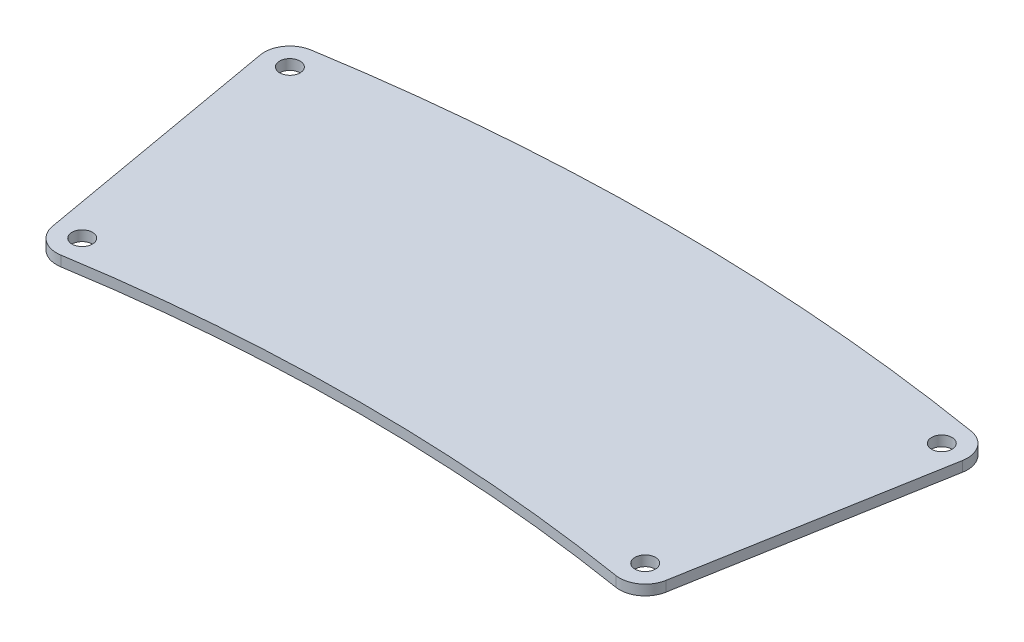
ISO-10303-21;
HEADER;
FILE_DESCRIPTION(('STEP AP214'),'2;1');
FILE_NAME('part.step','',(''),(''),'','','');
FILE_SCHEMA(('AUTOMOTIVE_DESIGN { 1 0 10303 214 1 1 1 1 }'));
ENDSEC;
DATA;
#1=APPLICATION_CONTEXT('core data for automotive mechanical design processes');
#2=APPLICATION_PROTOCOL_DEFINITION('international standard','automotive_design',2000,#1);
#3=PRODUCT_CONTEXT('',#1,'mechanical');
#4=PRODUCT('Part','Part','',(#3));
#5=PRODUCT_RELATED_PRODUCT_CATEGORY('part','',(#4));
#6=PRODUCT_DEFINITION_FORMATION('','',#4);
#7=PRODUCT_DEFINITION_CONTEXT('part definition',#1,'design');
#8=PRODUCT_DEFINITION('design','',#6,#7);
#9=PRODUCT_DEFINITION_SHAPE('','',#8);
#10=(LENGTH_UNIT() NAMED_UNIT(*) SI_UNIT(.MILLI.,.METRE.));
#11=(NAMED_UNIT(*) PLANE_ANGLE_UNIT() SI_UNIT($,.RADIAN.));
#12=(NAMED_UNIT(*) SI_UNIT($,.STERADIAN.) SOLID_ANGLE_UNIT());
#13=UNCERTAINTY_MEASURE_WITH_UNIT(LENGTH_MEASURE(1.E-05),#10,'distance_accuracy_value','');
#14=(GEOMETRIC_REPRESENTATION_CONTEXT(3) GLOBAL_UNCERTAINTY_ASSIGNED_CONTEXT((#13)) GLOBAL_UNIT_ASSIGNED_CONTEXT((#10,
#11,#12)) REPRESENTATION_CONTEXT('',''));
#15=CARTESIAN_POINT('',(0.,0.,0.));
#16=DIRECTION('',(0.,0.,1.));
#17=DIRECTION('',(1.,0.,0.));
#18=AXIS2_PLACEMENT_3D('',#15,#16,#17);
#19=CARTESIAN_POINT('',(0.,-2.,0.));
#20=DIRECTION('',(0.,1.,0.));
#21=DIRECTION('',(0.,0.,1.));
#22=AXIS2_PLACEMENT_3D('',#19,#20,#21);
#23=CYLINDRICAL_SURFACE('',#22,340.);
#24=CARTESIAN_POINT('',(0.,0.,0.));
#25=DIRECTION('',(0.,-1.,0.));
#26=DIRECTION('',(0.,0.,1.));
#27=AXIS2_PLACEMENT_3D('',#24,#25,#26);
#28=CIRCLE('',#27,340.);
#29=CARTESIAN_POINT('',(-54.1815037787085,0.,-335.655127546531));
#30=VERTEX_POINT('',#29);
#31=CARTESIAN_POINT('',(54.1815037787058,0.,-335.655127546531));
#32=VERTEX_POINT('',#31);
#33=EDGE_CURVE('E163',#30,#32,#28,.T.);
#34=ORIENTED_EDGE('',*,*,#33,.F.);
#35=DIRECTION('',(0.,1.,0.));
#36=VECTOR('',#35,1.);
#37=CARTESIAN_POINT('',(-54.1815037787085,-2.,-335.655127546531));
#38=LINE('',#37,#36);
#39=CARTESIAN_POINT('',(-54.1815037787085,-2.,-335.655127546531));
#40=VERTEX_POINT('',#39);
#41=EDGE_CURVE('E143',#30,#40,#38,.F.);
#42=ORIENTED_EDGE('',*,*,#41,.T.);
#43=CARTESIAN_POINT('',(0.,-2.,0.));
#44=DIRECTION('',(0.,-1.,0.));
#45=DIRECTION('',(0.,0.,1.));
#46=AXIS2_PLACEMENT_3D('',#43,#44,#45);
#47=CIRCLE('',#46,340.);
#48=CARTESIAN_POINT('',(54.1815037787058,-2.,-335.655127546531));
#49=VERTEX_POINT('',#48);
#50=EDGE_CURVE('E124',#40,#49,#47,.T.);
#51=ORIENTED_EDGE('',*,*,#50,.T.);
#52=DIRECTION('',(0.,1.,0.));
#53=VECTOR('',#52,1.);
#54=CARTESIAN_POINT('',(54.1815037787058,-2.,-335.655127546531));
#55=LINE('',#54,#53);
#56=EDGE_CURVE('E140',#49,#32,#55,.T.);
#57=ORIENTED_EDGE('',*,*,#56,.T.);
#58=EDGE_LOOP('',(#34,#42,#51,#57));
#59=FACE_BOUND('',#58,.T.);
#60=ADVANCED_FACE('F37',(#59),#23,.F.);
#61=CARTESIAN_POINT('',(-59.0403804067566,-2.,-334.834636024151));
#62=DIRECTION('',(-0.984807753012208,0.,0.173648177666931));
#63=DIRECTION('',(0.173648177666931,0.,0.984807753012208));
#64=AXIS2_PLACEMENT_3D('',#61,#62,#63);
#65=PLANE('',#64);
#66=DIRECTION('',(0.173648177666931,0.,0.984807753012208));
#67=VECTOR('',#66,1.);
#68=CARTESIAN_POINT('',(-59.0403804067566,-2.,-334.834636024151));
#69=LINE('',#68,#67);
#70=CARTESIAN_POINT('',(-68.5855347627996,-2.,-388.967896389022));
#71=VERTEX_POINT('',#70);
#72=CARTESIAN_POINT('',(-59.9023293640447,-2.,-339.722991475057));
#73=VERTEX_POINT('',#72);
#74=EDGE_CURVE('E129',#71,#73,#69,.T.);
#75=ORIENTED_EDGE('',*,*,#74,.T.);
#76=DIRECTION('',(0.,1.,0.));
#77=VECTOR('',#76,1.);
#78=CARTESIAN_POINT('',(-59.9023293640447,-2.,-339.722991475057));
#79=LINE('',#78,#77);
#80=CARTESIAN_POINT('',(-59.9023293640447,0.,-339.722991475057));
#81=VERTEX_POINT('',#80);
#82=EDGE_CURVE('E123',#73,#81,#79,.T.);
#83=ORIENTED_EDGE('',*,*,#82,.T.);
#84=DIRECTION('',(0.173648177666931,0.,0.984807753012208));
#85=VECTOR('',#84,1.);
#86=CARTESIAN_POINT('',(-59.0403804067566,0.,-334.834636024151));
#87=LINE('',#86,#85);
#88=CARTESIAN_POINT('',(-68.5855347627996,0.,-388.967896389022));
#89=VERTEX_POINT('',#88);
#90=EDGE_CURVE('E106',#89,#81,#87,.T.);
#91=ORIENTED_EDGE('',*,*,#90,.F.);
#92=DIRECTION('',(0.,1.,0.));
#93=VECTOR('',#92,1.);
#94=CARTESIAN_POINT('',(-68.5855347627996,-2.,-388.967896389022));
#95=LINE('',#94,#93);
#96=EDGE_CURVE('E120',#89,#71,#95,.F.);
#97=ORIENTED_EDGE('',*,*,#96,.T.);
#98=EDGE_LOOP('',(#75,#83,#91,#97));
#99=FACE_BOUND('',#98,.T.);
#100=ADVANCED_FACE('F119',(#99),#65,.T.);
#101=CARTESIAN_POINT('',(0.,-2.,0.));
#102=DIRECTION('',(0.,1.,0.));
#103=DIRECTION('',(0.,0.,1.));
#104=AXIS2_PLACEMENT_3D('',#101,#102,#103);
#105=CYLINDRICAL_SURFACE('',#104,400.);
#106=CARTESIAN_POINT('',(0.,-2.,0.));
#107=DIRECTION('',(0.,1.,0.));
#108=DIRECTION('',(0.,0.,1.));
#109=AXIS2_PLACEMENT_3D('',#106,#107,#108);
#110=CIRCLE('',#109,400.);
#111=CARTESIAN_POINT('',(64.4673377192258,-2.,-394.770771926437));
#112=VERTEX_POINT('',#111);
#113=CARTESIAN_POINT('',(-64.467337719229,-2.,-394.770771926437));
#114=VERTEX_POINT('',#113);
#115=EDGE_CURVE('E133',#112,#114,#110,.T.);
#116=ORIENTED_EDGE('',*,*,#115,.T.);
#117=DIRECTION('',(0.,1.,0.));
#118=VECTOR('',#117,1.);
#119=CARTESIAN_POINT('',(-64.467337719229,-2.,-394.770771926437));
#120=LINE('',#119,#118);
#121=CARTESIAN_POINT('',(-64.467337719229,0.,-394.770771926437));
#122=VERTEX_POINT('',#121);
#123=EDGE_CURVE('E153',#114,#122,#120,.T.);
#124=ORIENTED_EDGE('',*,*,#123,.T.);
#125=CARTESIAN_POINT('',(0.,0.,0.));
#126=DIRECTION('',(0.,1.,0.));
#127=DIRECTION('',(0.,0.,1.));
#128=AXIS2_PLACEMENT_3D('',#125,#126,#127);
#129=CIRCLE('',#128,400.);
#130=CARTESIAN_POINT('',(64.4673377192258,0.,-394.770771926437));
#131=VERTEX_POINT('',#130);
#132=EDGE_CURVE('E108',#131,#122,#129,.T.);
#133=ORIENTED_EDGE('',*,*,#132,.F.);
#134=DIRECTION('',(0.,1.,0.));
#135=VECTOR('',#134,1.);
#136=CARTESIAN_POINT('',(64.4673377192258,-2.,-394.770771926438));
#137=LINE('',#136,#135);
#138=EDGE_CURVE('E151',#131,#112,#137,.F.);
#139=ORIENTED_EDGE('',*,*,#138,.T.);
#140=EDGE_LOOP('',(#116,#124,#133,#139));
#141=FACE_BOUND('',#140,.T.);
#142=ADVANCED_FACE('F156',(#141),#105,.T.);
#143=CARTESIAN_POINT('',(69.4592710667694,-2.,-393.923101204884));
#144=DIRECTION('',(0.984807753012209,0.,0.173648177666924));
#145=DIRECTION('',(0.173648177666924,0.,-0.984807753012209));
#146=AXIS2_PLACEMENT_3D('',#143,#144,#145);
#147=PLANE('',#146);
#148=DIRECTION('',(0.173648177666924,0.,-0.984807753012209));
#149=VECTOR('',#148,1.);
#150=CARTESIAN_POINT('',(69.4592710667694,-2.,-393.923101204884));
#151=LINE('',#150,#149);
#152=CARTESIAN_POINT('',(59.902329364042,-2.,-339.722991475057));
#153=VERTEX_POINT('',#152);
#154=CARTESIAN_POINT('',(68.5855347627966,-2.,-388.967896389023));
#155=VERTEX_POINT('',#154);
#156=EDGE_CURVE('E158',#153,#155,#151,.T.);
#157=ORIENTED_EDGE('',*,*,#156,.T.);
#158=DIRECTION('',(0.,1.,0.));
#159=VECTOR('',#158,1.);
#160=CARTESIAN_POINT('',(68.5855347627966,-2.,-388.967896389023));
#161=LINE('',#160,#159);
#162=CARTESIAN_POINT('',(68.5855347627966,0.,-388.967896389023));
#163=VERTEX_POINT('',#162);
#164=EDGE_CURVE('E11',#155,#163,#161,.T.);
#165=ORIENTED_EDGE('',*,*,#164,.T.);
#166=DIRECTION('',(0.173648177666924,0.,-0.984807753012209));
#167=VECTOR('',#166,1.);
#168=CARTESIAN_POINT('',(69.4592710667694,0.,-393.923101204884));
#169=LINE('',#168,#167);
#170=CARTESIAN_POINT('',(59.902329364042,0.,-339.722991475057));
#171=VERTEX_POINT('',#170);
#172=EDGE_CURVE('E166',#171,#163,#169,.T.);
#173=ORIENTED_EDGE('',*,*,#172,.F.);
#174=DIRECTION('',(0.,1.,0.));
#175=VECTOR('',#174,1.);
#176=CARTESIAN_POINT('',(59.902329364042,-2.,-339.722991475057));
#177=LINE('',#176,#175);
#178=EDGE_CURVE('E45',#171,#153,#177,.F.);
#179=ORIENTED_EDGE('',*,*,#178,.T.);
#180=EDGE_LOOP('',(#157,#165,#173,#179));
#181=FACE_BOUND('',#180,.T.);
#182=ADVANCED_FACE('F169',(#181),#147,.T.);
#183=CARTESIAN_POINT('',(0.,-2.,0.));
#184=DIRECTION('',(0.,1.,0.));
#185=DIRECTION('',(0.,0.,1.));
#186=AXIS2_PLACEMENT_3D('',#183,#184,#185);
#187=PLANE('',#186);
#188=CARTESIAN_POINT('',(54.9782905989809,-2.,-340.591232363392));
#189=DIRECTION('',(0.,1.,0.));
#190=DIRECTION('',(0.,0.,1.));
#191=AXIS2_PLACEMENT_3D('',#188,#189,#190);
#192=CIRCLE('',#191,2.);
#193=CARTESIAN_POINT('',(54.9782905989809,-2.,-338.591232363392));
#194=VERTEX_POINT('',#193);
#195=EDGE_CURVE('E199',#194,#194,#192,.T.);
#196=ORIENTED_EDGE('',*,*,#195,.T.);
#197=EDGE_LOOP('',(#196));
#198=FACE_BOUND('',#197,.T.);
#199=CARTESIAN_POINT('',(63.6614959977355,-2.,-389.836137277357));
#200=DIRECTION('',(0.,1.,0.));
#201=DIRECTION('',(0.,0.,1.));
#202=AXIS2_PLACEMENT_3D('',#199,#200,#201);
#203=CIRCLE('',#202,2.);
#204=CARTESIAN_POINT('',(63.6614959977355,-2.,-387.836137277357));
#205=VERTEX_POINT('',#204);
#206=EDGE_CURVE('E193',#205,#205,#203,.T.);
#207=ORIENTED_EDGE('',*,*,#206,.T.);
#208=EDGE_LOOP('',(#207));
#209=FACE_BOUND('',#208,.T.);
#210=CARTESIAN_POINT('',(-54.9782905989836,-2.,-340.591232363391));
#211=DIRECTION('',(0.,1.,0.));
#212=DIRECTION('',(0.,0.,1.));
#213=AXIS2_PLACEMENT_3D('',#210,#211,#212);
#214=CIRCLE('',#213,2.);
#215=CARTESIAN_POINT('',(-54.9782905989836,-2.,-338.591232363391));
#216=VERTEX_POINT('',#215);
#217=EDGE_CURVE('E187',#216,#216,#214,.T.);
#218=ORIENTED_EDGE('',*,*,#217,.T.);
#219=EDGE_LOOP('',(#218));
#220=FACE_BOUND('',#219,.T.);
#221=CARTESIAN_POINT('',(-63.6614959977386,-2.,-389.836137277356));
#222=DIRECTION('',(0.,1.,0.));
#223=DIRECTION('',(0.,0.,1.));
#224=AXIS2_PLACEMENT_3D('',#221,#222,#223);
#225=CIRCLE('',#224,2.);
#226=CARTESIAN_POINT('',(-63.6614959977386,-2.,-387.836137277356));
#227=VERTEX_POINT('',#226);
#228=EDGE_CURVE('E167',#227,#227,#225,.T.);
#229=ORIENTED_EDGE('',*,*,#228,.T.);
#230=EDGE_LOOP('',(#229));
#231=FACE_BOUND('',#230,.T.);
#232=ORIENTED_EDGE('',*,*,#50,.F.);
#233=CARTESIAN_POINT('',(-54.9782905989836,-2.,-340.591232363391));
#234=DIRECTION('',(0.,1.,0.));
#235=DIRECTION('',(0.,0.,1.));
#236=AXIS2_PLACEMENT_3D('',#233,#234,#235);
#237=CIRCLE('',#236,5.);
#238=EDGE_CURVE('E149',#40,#73,#237,.F.);
#239=ORIENTED_EDGE('',*,*,#238,.T.);
#240=ORIENTED_EDGE('',*,*,#74,.F.);
#241=CARTESIAN_POINT('',(-63.6614959977386,-2.,-389.836137277356));
#242=DIRECTION('',(0.,1.,0.));
#243=DIRECTION('',(0.,0.,1.));
#244=AXIS2_PLACEMENT_3D('',#241,#242,#243);
#245=CIRCLE('',#244,5.);
#246=EDGE_CURVE('E128',#71,#114,#245,.F.);
#247=ORIENTED_EDGE('',*,*,#246,.T.);
#248=ORIENTED_EDGE('',*,*,#115,.F.);
#249=CARTESIAN_POINT('',(63.6614959977355,-2.,-389.836137277357));
#250=DIRECTION('',(0.,1.,0.));
#251=DIRECTION('',(0.,0.,1.));
#252=AXIS2_PLACEMENT_3D('',#249,#250,#251);
#253=CIRCLE('',#252,5.);
#254=EDGE_CURVE('E52',#112,#155,#253,.F.);
#255=ORIENTED_EDGE('',*,*,#254,.T.);
#256=ORIENTED_EDGE('',*,*,#156,.F.);
#257=CARTESIAN_POINT('',(54.9782905989809,-2.,-340.591232363392));
#258=DIRECTION('',(0.,1.,0.));
#259=DIRECTION('',(0.,0.,1.));
#260=AXIS2_PLACEMENT_3D('',#257,#258,#259);
#261=CIRCLE('',#260,5.);
#262=EDGE_CURVE('E145',#153,#49,#261,.F.);
#263=ORIENTED_EDGE('',*,*,#262,.T.);
#264=EDGE_LOOP('',(#232,#239,#240,#247,#248,#255,#256,#263));
#265=FACE_BOUND('',#264,.T.);
#266=ADVANCED_FACE('F176',(#198,#209,#220,#231,#265),#187,.F.);
#267=CARTESIAN_POINT('',(0.,0.,0.));
#268=DIRECTION('',(0.,1.,0.));
#269=DIRECTION('',(0.,0.,1.));
#270=AXIS2_PLACEMENT_3D('',#267,#268,#269);
#271=PLANE('',#270);
#272=CARTESIAN_POINT('',(54.9782905989809,0.,-340.591232363392));
#273=DIRECTION('',(0.,1.,0.));
#274=DIRECTION('',(0.,0.,1.));
#275=AXIS2_PLACEMENT_3D('',#272,#273,#274);
#276=CIRCLE('',#275,2.);
#277=CARTESIAN_POINT('',(54.9782905989809,0.,-338.591232363392));
#278=VERTEX_POINT('',#277);
#279=EDGE_CURVE('E202',#278,#278,#276,.T.);
#280=ORIENTED_EDGE('',*,*,#279,.F.);
#281=EDGE_LOOP('',(#280));
#282=FACE_BOUND('',#281,.T.);
#283=CARTESIAN_POINT('',(63.6614959977355,0.,-389.836137277357));
#284=DIRECTION('',(0.,1.,0.));
#285=DIRECTION('',(0.,0.,1.));
#286=AXIS2_PLACEMENT_3D('',#283,#284,#285);
#287=CIRCLE('',#286,2.);
#288=CARTESIAN_POINT('',(63.6614959977355,0.,-387.836137277357));
#289=VERTEX_POINT('',#288);
#290=EDGE_CURVE('E196',#289,#289,#287,.T.);
#291=ORIENTED_EDGE('',*,*,#290,.F.);
#292=EDGE_LOOP('',(#291));
#293=FACE_BOUND('',#292,.T.);
#294=CARTESIAN_POINT('',(-54.9782905989836,0.,-340.591232363391));
#295=DIRECTION('',(0.,1.,0.));
#296=DIRECTION('',(0.,0.,1.));
#297=AXIS2_PLACEMENT_3D('',#294,#295,#296);
#298=CIRCLE('',#297,2.);
#299=CARTESIAN_POINT('',(-54.9782905989836,0.,-338.591232363391));
#300=VERTEX_POINT('',#299);
#301=EDGE_CURVE('E190',#300,#300,#298,.T.);
#302=ORIENTED_EDGE('',*,*,#301,.F.);
#303=EDGE_LOOP('',(#302));
#304=FACE_BOUND('',#303,.T.);
#305=CARTESIAN_POINT('',(-63.6614959977386,0.,-389.836137277356));
#306=DIRECTION('',(0.,1.,0.));
#307=DIRECTION('',(0.,0.,1.));
#308=AXIS2_PLACEMENT_3D('',#305,#306,#307);
#309=CIRCLE('',#308,2.);
#310=CARTESIAN_POINT('',(-63.6614959977386,0.,-387.836137277356));
#311=VERTEX_POINT('',#310);
#312=EDGE_CURVE('E184',#311,#311,#309,.T.);
#313=ORIENTED_EDGE('',*,*,#312,.F.);
#314=EDGE_LOOP('',(#313));
#315=FACE_BOUND('',#314,.T.);
#316=ORIENTED_EDGE('',*,*,#90,.T.);
#317=CARTESIAN_POINT('',(-54.9782905989836,0.,-340.591232363391));
#318=DIRECTION('',(0.,1.,0.));
#319=DIRECTION('',(0.,0.,1.));
#320=AXIS2_PLACEMENT_3D('',#317,#318,#319);
#321=CIRCLE('',#320,5.);
#322=EDGE_CURVE('E113',#81,#30,#321,.T.);
#323=ORIENTED_EDGE('',*,*,#322,.T.);
#324=ORIENTED_EDGE('',*,*,#33,.T.);
#325=CARTESIAN_POINT('',(54.9782905989809,0.,-340.591232363392));
#326=DIRECTION('',(0.,1.,0.));
#327=DIRECTION('',(0.,0.,1.));
#328=AXIS2_PLACEMENT_3D('',#325,#326,#327);
#329=CIRCLE('',#328,5.);
#330=EDGE_CURVE('E131',#32,#171,#329,.T.);
#331=ORIENTED_EDGE('',*,*,#330,.T.);
#332=ORIENTED_EDGE('',*,*,#172,.T.);
#333=CARTESIAN_POINT('',(63.6614959977355,0.,-389.836137277357));
#334=DIRECTION('',(0.,1.,0.));
#335=DIRECTION('',(0.,0.,1.));
#336=AXIS2_PLACEMENT_3D('',#333,#334,#335);
#337=CIRCLE('',#336,5.);
#338=EDGE_CURVE('E114',#163,#131,#337,.T.);
#339=ORIENTED_EDGE('',*,*,#338,.T.);
#340=ORIENTED_EDGE('',*,*,#132,.T.);
#341=CARTESIAN_POINT('',(-63.6614959977386,0.,-389.836137277356));
#342=DIRECTION('',(0.,1.,0.));
#343=DIRECTION('',(0.,0.,1.));
#344=AXIS2_PLACEMENT_3D('',#341,#342,#343);
#345=CIRCLE('',#344,5.);
#346=EDGE_CURVE('E103',#122,#89,#345,.T.);
#347=ORIENTED_EDGE('',*,*,#346,.T.);
#348=EDGE_LOOP('',(#316,#323,#324,#331,#332,#339,#340,#347));
#349=FACE_BOUND('',#348,.T.);
#350=ADVANCED_FACE('F105',(#282,#293,#304,#315,#349),#271,.T.);
#351=CARTESIAN_POINT('',(-54.9782905989836,-2.,-340.591232363391));
#352=DIRECTION('',(0.,1.,0.));
#353=DIRECTION('',(0.,0.,1.));
#354=AXIS2_PLACEMENT_3D('',#351,#352,#353);
#355=CYLINDRICAL_SURFACE('',#354,5.);
#356=ORIENTED_EDGE('',*,*,#238,.F.);
#357=ORIENTED_EDGE('',*,*,#41,.F.);
#358=ORIENTED_EDGE('',*,*,#322,.F.);
#359=ORIENTED_EDGE('',*,*,#82,.F.);
#360=EDGE_LOOP('',(#356,#357,#358,#359));
#361=FACE_BOUND('',#360,.T.);
#362=ADVANCED_FACE('F211',(#361),#355,.T.);
#363=CARTESIAN_POINT('',(-63.6614959977386,-2.,-389.836137277356));
#364=DIRECTION('',(0.,1.,0.));
#365=DIRECTION('',(0.,0.,1.));
#366=AXIS2_PLACEMENT_3D('',#363,#364,#365);
#367=CYLINDRICAL_SURFACE('',#366,5.);
#368=ORIENTED_EDGE('',*,*,#246,.F.);
#369=ORIENTED_EDGE('',*,*,#96,.F.);
#370=ORIENTED_EDGE('',*,*,#346,.F.);
#371=ORIENTED_EDGE('',*,*,#123,.F.);
#372=EDGE_LOOP('',(#368,#369,#370,#371));
#373=FACE_BOUND('',#372,.T.);
#374=ADVANCED_FACE('F127',(#373),#367,.T.);
#375=CARTESIAN_POINT('',(63.6614959977355,-2.,-389.836137277357));
#376=DIRECTION('',(0.,1.,0.));
#377=DIRECTION('',(0.,0.,1.));
#378=AXIS2_PLACEMENT_3D('',#375,#376,#377);
#379=CYLINDRICAL_SURFACE('',#378,5.);
#380=ORIENTED_EDGE('',*,*,#254,.F.);
#381=ORIENTED_EDGE('',*,*,#138,.F.);
#382=ORIENTED_EDGE('',*,*,#338,.F.);
#383=ORIENTED_EDGE('',*,*,#164,.F.);
#384=EDGE_LOOP('',(#380,#381,#382,#383));
#385=FACE_BOUND('',#384,.T.);
#386=ADVANCED_FACE('F246',(#385),#379,.T.);
#387=CARTESIAN_POINT('',(54.9782905989809,-2.,-340.591232363392));
#388=DIRECTION('',(0.,1.,0.));
#389=DIRECTION('',(0.,0.,1.));
#390=AXIS2_PLACEMENT_3D('',#387,#388,#389);
#391=CYLINDRICAL_SURFACE('',#390,5.);
#392=ORIENTED_EDGE('',*,*,#262,.F.);
#393=ORIENTED_EDGE('',*,*,#178,.F.);
#394=ORIENTED_EDGE('',*,*,#330,.F.);
#395=ORIENTED_EDGE('',*,*,#56,.F.);
#396=EDGE_LOOP('',(#392,#393,#394,#395));
#397=FACE_BOUND('',#396,.T.);
#398=ADVANCED_FACE('F39',(#397),#391,.T.);
#399=CARTESIAN_POINT('',(-63.6614959977386,-10.,-389.836137277356));
#400=DIRECTION('',(0.,1.,0.));
#401=DIRECTION('',(0.,0.,1.));
#402=AXIS2_PLACEMENT_3D('',#399,#400,#401);
#403=CYLINDRICAL_SURFACE('',#402,2.);
#404=ORIENTED_EDGE('',*,*,#312,.T.);
#405=EDGE_LOOP('',(#404));
#406=FACE_BOUND('',#405,.T.);
#407=ORIENTED_EDGE('',*,*,#228,.F.);
#408=EDGE_LOOP('',(#407));
#409=FACE_BOUND('',#408,.T.);
#410=ADVANCED_FACE('F219',(#406,#409),#403,.F.);
#411=CARTESIAN_POINT('',(-54.9782905989836,-10.,-340.591232363391));
#412=DIRECTION('',(0.,1.,0.));
#413=DIRECTION('',(0.,0.,1.));
#414=AXIS2_PLACEMENT_3D('',#411,#412,#413);
#415=CYLINDRICAL_SURFACE('',#414,2.);
#416=ORIENTED_EDGE('',*,*,#301,.T.);
#417=EDGE_LOOP('',(#416));
#418=FACE_BOUND('',#417,.T.);
#419=ORIENTED_EDGE('',*,*,#217,.F.);
#420=EDGE_LOOP('',(#419));
#421=FACE_BOUND('',#420,.T.);
#422=ADVANCED_FACE('F222',(#418,#421),#415,.F.);
#423=CARTESIAN_POINT('',(63.6614959977355,-10.,-389.836137277357));
#424=DIRECTION('',(0.,1.,0.));
#425=DIRECTION('',(0.,0.,1.));
#426=AXIS2_PLACEMENT_3D('',#423,#424,#425);
#427=CYLINDRICAL_SURFACE('',#426,2.);
#428=ORIENTED_EDGE('',*,*,#290,.T.);
#429=EDGE_LOOP('',(#428));
#430=FACE_BOUND('',#429,.T.);
#431=ORIENTED_EDGE('',*,*,#206,.F.);
#432=EDGE_LOOP('',(#431));
#433=FACE_BOUND('',#432,.T.);
#434=ADVANCED_FACE('F265',(#430,#433),#427,.F.);
#435=CARTESIAN_POINT('',(54.9782905989809,-10.,-340.591232363392));
#436=DIRECTION('',(0.,1.,0.));
#437=DIRECTION('',(0.,0.,1.));
#438=AXIS2_PLACEMENT_3D('',#435,#436,#437);
#439=CYLINDRICAL_SURFACE('',#438,2.);
#440=ORIENTED_EDGE('',*,*,#279,.T.);
#441=EDGE_LOOP('',(#440));
#442=FACE_BOUND('',#441,.T.);
#443=ORIENTED_EDGE('',*,*,#195,.F.);
#444=EDGE_LOOP('',(#443));
#445=FACE_BOUND('',#444,.T.);
#446=ADVANCED_FACE('F206',(#442,#445),#439,.F.);
#447=CLOSED_SHELL('',(#60,#100,#142,#182,#266,#350,#362,#374,#386,#398,#410,#422,#434,#446));
#448=MANIFOLD_SOLID_BREP('B2',#447);
#449=ADVANCED_BREP_SHAPE_REPRESENTATION('',(#18,#448),#14);
#450=SHAPE_DEFINITION_REPRESENTATION(#9,#449);
ENDSEC;
END-ISO-10303-21;
